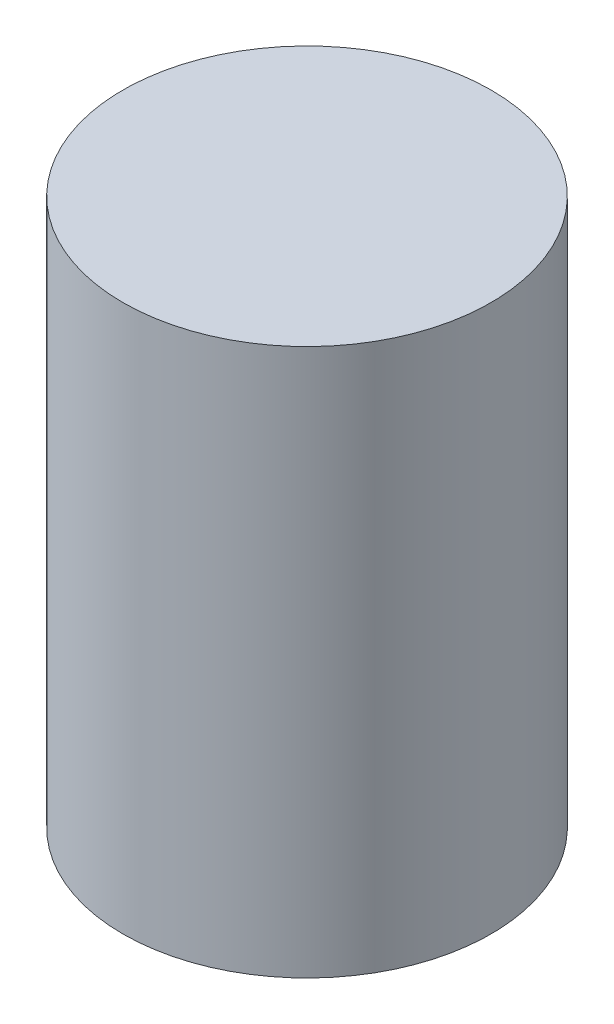
ISO-10303-21;
HEADER;
FILE_DESCRIPTION(('STEP AP214'),'2;1');
FILE_NAME('part.step','',(''),(''),'','','');
FILE_SCHEMA(('AUTOMOTIVE_DESIGN { 1 0 10303 214 1 1 1 1 }'));
ENDSEC;
DATA;
#1=APPLICATION_CONTEXT('core data for automotive mechanical design processes');
#2=APPLICATION_PROTOCOL_DEFINITION('international standard','automotive_design',2000,#1);
#3=PRODUCT_CONTEXT('',#1,'mechanical');
#4=PRODUCT('Part','Part','',(#3));
#5=PRODUCT_RELATED_PRODUCT_CATEGORY('part','',(#4));
#6=PRODUCT_DEFINITION_FORMATION('','',#4);
#7=PRODUCT_DEFINITION_CONTEXT('part definition',#1,'design');
#8=PRODUCT_DEFINITION('design','',#6,#7);
#9=PRODUCT_DEFINITION_SHAPE('','',#8);
#10=(LENGTH_UNIT() NAMED_UNIT(*) SI_UNIT(.MILLI.,.METRE.));
#11=(NAMED_UNIT(*) PLANE_ANGLE_UNIT() SI_UNIT($,.RADIAN.));
#12=(NAMED_UNIT(*) SI_UNIT($,.STERADIAN.) SOLID_ANGLE_UNIT());
#13=UNCERTAINTY_MEASURE_WITH_UNIT(LENGTH_MEASURE(1.E-05),#10,'distance_accuracy_value','');
#14=(GEOMETRIC_REPRESENTATION_CONTEXT(3) GLOBAL_UNCERTAINTY_ASSIGNED_CONTEXT((#13)) GLOBAL_UNIT_ASSIGNED_CONTEXT((#10,
#11,#12)) REPRESENTATION_CONTEXT('',''));
#15=CARTESIAN_POINT('',(0.,0.,0.));
#16=DIRECTION('',(0.,0.,1.));
#17=DIRECTION('',(1.,0.,0.));
#18=AXIS2_PLACEMENT_3D('',#15,#16,#17);
#19=CARTESIAN_POINT('',(0.,20.2,0.));
#20=DIRECTION('',(0.,-1.,0.));
#21=DIRECTION('',(0.,0.,-1.));
#22=AXIS2_PLACEMENT_3D('',#19,#20,#21);
#23=CYLINDRICAL_SURFACE('',#22,6.8);
#24=CARTESIAN_POINT('',(0.,20.2,0.));
#25=DIRECTION('',(0.,1.,0.));
#26=DIRECTION('',(0.,0.,1.));
#27=AXIS2_PLACEMENT_3D('',#24,#25,#26);
#28=CIRCLE('',#27,6.8);
#29=CARTESIAN_POINT('',(0.,20.2,6.8));
#30=VERTEX_POINT('',#29);
#31=EDGE_CURVE('E10',#30,#30,#28,.T.);
#32=ORIENTED_EDGE('',*,*,#31,.F.);
#33=EDGE_LOOP('',(#32));
#34=FACE_BOUND('',#33,.T.);
#35=CARTESIAN_POINT('',(0.,0.,0.));
#36=DIRECTION('',(0.,1.,0.));
#37=DIRECTION('',(0.,0.,1.));
#38=AXIS2_PLACEMENT_3D('',#35,#36,#37);
#39=CIRCLE('',#38,6.8);
#40=CARTESIAN_POINT('',(0.,0.,6.8));
#41=VERTEX_POINT('',#40);
#42=EDGE_CURVE('E36',#41,#41,#39,.T.);
#43=ORIENTED_EDGE('',*,*,#42,.T.);
#44=EDGE_LOOP('',(#43));
#45=FACE_BOUND('',#44,.T.);
#46=ADVANCED_FACE('F33',(#34,#45),#23,.T.);
#47=CARTESIAN_POINT('',(0.,20.2,0.));
#48=DIRECTION('',(0.,1.,0.));
#49=DIRECTION('',(0.,0.,1.));
#50=AXIS2_PLACEMENT_3D('',#47,#48,#49);
#51=PLANE('',#50);
#52=ORIENTED_EDGE('',*,*,#31,.T.);
#53=EDGE_LOOP('',(#52));
#54=FACE_BOUND('',#53,.T.);
#55=ADVANCED_FACE('F48',(#54),#51,.T.);
#56=CARTESIAN_POINT('',(0.,0.,0.));
#57=DIRECTION('',(0.,1.,0.));
#58=DIRECTION('',(0.,0.,1.));
#59=AXIS2_PLACEMENT_3D('',#56,#57,#58);
#60=PLANE('',#59);
#61=ORIENTED_EDGE('',*,*,#42,.F.);
#62=EDGE_LOOP('',(#61));
#63=FACE_BOUND('',#62,.T.);
#64=ADVANCED_FACE('F46',(#63),#60,.F.);
#65=CLOSED_SHELL('',(#46,#55,#64));
#66=MANIFOLD_SOLID_BREP('B2',#65);
#67=ADVANCED_BREP_SHAPE_REPRESENTATION('',(#18,#66),#14);
#68=SHAPE_DEFINITION_REPRESENTATION(#9,#67);
ENDSEC;
END-ISO-10303-21;
